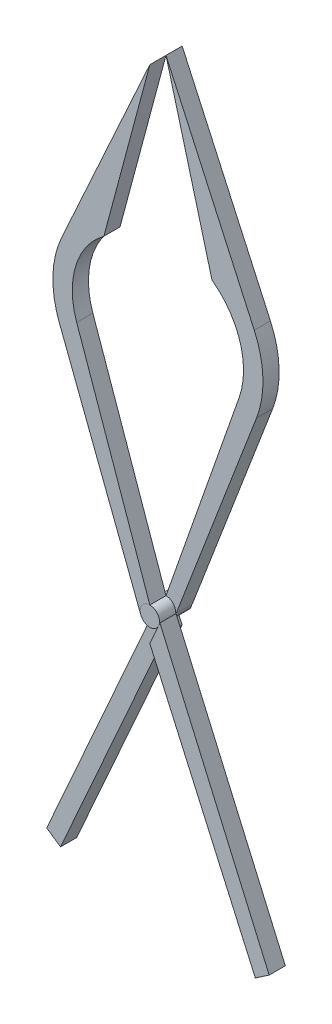
ISO-10303-21;
HEADER;
FILE_DESCRIPTION(('STEP AP214'),'2;1');
FILE_NAME('part.step','',(''),(''),'','','');
FILE_SCHEMA(('AUTOMOTIVE_DESIGN { 1 0 10303 214 1 1 1 1 }'));
ENDSEC;
DATA;
#1=APPLICATION_CONTEXT('core data for automotive mechanical design processes');
#2=APPLICATION_PROTOCOL_DEFINITION('international standard','automotive_design',2000,#1);
#3=PRODUCT_CONTEXT('',#1,'mechanical');
#4=PRODUCT('Part','Part','',(#3));
#5=PRODUCT_RELATED_PRODUCT_CATEGORY('part','',(#4));
#6=PRODUCT_DEFINITION_FORMATION('','',#4);
#7=PRODUCT_DEFINITION_CONTEXT('part definition',#1,'design');
#8=PRODUCT_DEFINITION('design','',#6,#7);
#9=PRODUCT_DEFINITION_SHAPE('','',#8);
#10=(LENGTH_UNIT() NAMED_UNIT(*) SI_UNIT(.MILLI.,.METRE.));
#11=(NAMED_UNIT(*) PLANE_ANGLE_UNIT() SI_UNIT($,.RADIAN.));
#12=(NAMED_UNIT(*) SI_UNIT($,.STERADIAN.) SOLID_ANGLE_UNIT());
#13=UNCERTAINTY_MEASURE_WITH_UNIT(LENGTH_MEASURE(1.E-05),#10,'distance_accuracy_value','');
#14=(GEOMETRIC_REPRESENTATION_CONTEXT(3) GLOBAL_UNCERTAINTY_ASSIGNED_CONTEXT((#13)) GLOBAL_UNIT_ASSIGNED_CONTEXT((#10,
#11,#12)) REPRESENTATION_CONTEXT('',''));
#15=CARTESIAN_POINT('',(0.,0.,0.));
#16=DIRECTION('',(0.,0.,1.));
#17=DIRECTION('',(1.,0.,0.));
#18=AXIS2_PLACEMENT_3D('',#15,#16,#17);
#19=CARTESIAN_POINT('',(0.,-37.6826435132161,-2.5));
#20=DIRECTION('',(0.,0.,1.));
#21=DIRECTION('',(1.,0.,0.));
#22=AXIS2_PLACEMENT_3D('',#19,#20,#21);
#23=CYLINDRICAL_SURFACE('',#22,1.49574831072217);
#24=CARTESIAN_POINT('',(0.,-37.6826435132161,0.));
#25=DIRECTION('',(0.,0.,1.));
#26=DIRECTION('',(1.,0.,0.));
#27=AXIS2_PLACEMENT_3D('',#24,#25,#26);
#28=CIRCLE('',#27,1.49574831072217);
#29=CARTESIAN_POINT('',(-1.39640134585648,-38.2186717683655,0.));
#30=VERTEX_POINT('',#29);
#31=CARTESIAN_POINT('',(-1.36640538749044,-38.2910835892017,0.));
#32=VERTEX_POINT('',#31);
#33=EDGE_CURVE('E134',#30,#32,#28,.T.);
#34=ORIENTED_EDGE('',*,*,#33,.T.);
#35=DIRECTION('',(0.,0.,1.));
#36=VECTOR('',#35,1.);
#37=CARTESIAN_POINT('',(-1.36640538749044,-38.2910835892017,-2.5));
#38=LINE('',#37,#36);
#39=CARTESIAN_POINT('',(-1.36640538749044,-38.2910835892017,-2.5));
#40=VERTEX_POINT('',#39);
#41=EDGE_CURVE('E12',#40,#32,#38,.T.);
#42=ORIENTED_EDGE('',*,*,#41,.F.);
#43=CARTESIAN_POINT('',(0.,-37.6826435132161,-2.5));
#44=DIRECTION('',(0.,0.,1.));
#45=DIRECTION('',(1.,0.,0.));
#46=AXIS2_PLACEMENT_3D('',#43,#44,#45);
#47=CIRCLE('',#46,1.49574831072217);
#48=CARTESIAN_POINT('',(-1.39640134585648,-38.2186717683655,-2.5));
#49=VERTEX_POINT('',#48);
#50=EDGE_CURVE('E76',#49,#40,#47,.T.);
#51=ORIENTED_EDGE('',*,*,#50,.F.);
#52=DIRECTION('',(0.,0.,1.));
#53=VECTOR('',#52,1.);
#54=CARTESIAN_POINT('',(-1.39640134585648,-38.2186717683655,-2.5));
#55=LINE('',#54,#53);
#56=EDGE_CURVE('E61',#49,#30,#55,.T.);
#57=ORIENTED_EDGE('',*,*,#56,.T.);
#58=EDGE_LOOP('',(#34,#42,#51,#57));
#59=FACE_BOUND('',#58,.T.);
#60=ADVANCED_FACE('F58',(#59),#23,.F.);
#61=CARTESIAN_POINT('',(-15.3694250089117,-6.8437772610449,-2.5));
#62=DIRECTION('',(0.913526278248464,0.406779717967244,0.));
#63=DIRECTION('',(-0.406779717967244,0.913526278248464,0.));
#64=AXIS2_PLACEMENT_3D('',#61,#62,#63);
#65=PLANE('',#64);
#66=DIRECTION('',(-0.406779717967244,0.913526278248464,0.));
#67=VECTOR('',#66,1.);
#68=CARTESIAN_POINT('',(-15.3694250089117,-6.8437772610449,0.));
#69=LINE('',#68,#67);
#70=CARTESIAN_POINT('',(-0.00103530845089843,-41.3573658831415,0.));
#71=VERTEX_POINT('',#70);
#72=EDGE_CURVE('E142',#71,#32,#69,.T.);
#73=ORIENTED_EDGE('',*,*,#72,.F.);
#74=DIRECTION('',(0.,0.,1.));
#75=VECTOR('',#74,1.);
#76=CARTESIAN_POINT('',(-0.00103530845089843,-41.3573658831415,-2.5));
#77=LINE('',#76,#75);
#78=CARTESIAN_POINT('',(-0.00103530845089843,-41.3573658831415,-2.5));
#79=VERTEX_POINT('',#78);
#80=EDGE_CURVE('E67',#79,#71,#77,.T.);
#81=ORIENTED_EDGE('',*,*,#80,.F.);
#82=DIRECTION('',(-0.406779717967244,0.913526278248464,0.));
#83=VECTOR('',#82,1.);
#84=CARTESIAN_POINT('',(-15.3694250089117,-6.8437772610449,-2.5));
#85=LINE('',#84,#83);
#86=EDGE_CURVE('E117',#79,#40,#85,.T.);
#87=ORIENTED_EDGE('',*,*,#86,.T.);
#88=ORIENTED_EDGE('',*,*,#41,.T.);
#89=EDGE_LOOP('',(#73,#81,#87,#88));
#90=FACE_BOUND('',#89,.T.);
#91=ADVANCED_FACE('F158',(#90),#65,.T.);
#92=CARTESIAN_POINT('',(15.3663921932048,-6.84155859411592,-2.5));
#93=DIRECTION('',(-0.913545457642601,0.4067366430758,0.));
#94=DIRECTION('',(-0.4067366430758,-0.913545457642601,0.));
#95=AXIS2_PLACEMENT_3D('',#92,#93,#94);
#96=PLANE('',#95);
#97=DIRECTION('',(-0.4067366430758,-0.913545457642601,0.));
#98=VECTOR('',#97,1.);
#99=CARTESIAN_POINT('',(15.3663921932048,-6.84155859411592,0.));
#100=LINE('',#99,#98);
#101=CARTESIAN_POINT('',(-16.3178548927108,-78.0055427025498,0.));
#102=VERTEX_POINT('',#101);
#103=EDGE_CURVE('E121',#71,#102,#100,.T.);
#104=ORIENTED_EDGE('',*,*,#103,.T.);
#105=DIRECTION('',(0.,0.,1.));
#106=VECTOR('',#105,1.);
#107=CARTESIAN_POINT('',(-16.3178548927108,-78.0055427025498,-2.5));
#108=LINE('',#107,#106);
#109=CARTESIAN_POINT('',(-16.3178548927108,-78.0055427025498,-2.5));
#110=VERTEX_POINT('',#109);
#111=EDGE_CURVE('E119',#110,#102,#108,.T.);
#112=ORIENTED_EDGE('',*,*,#111,.F.);
#113=DIRECTION('',(-0.4067366430758,-0.913545457642601,0.));
#114=VECTOR('',#113,1.);
#115=CARTESIAN_POINT('',(15.3663921932048,-6.84155859411592,-2.5));
#116=LINE('',#115,#114);
#117=EDGE_CURVE('E112',#79,#110,#116,.T.);
#118=ORIENTED_EDGE('',*,*,#117,.F.);
#119=ORIENTED_EDGE('',*,*,#80,.T.);
#120=EDGE_LOOP('',(#104,#112,#118,#119));
#121=FACE_BOUND('',#120,.T.);
#122=ADVANCED_FACE('F120',(#121),#96,.F.);
#123=CARTESIAN_POINT('',(-41.4493231296583,-60.901032136183,-2.5));
#124=DIRECTION('',(-0.562649902814867,-0.826695280537164,0.));
#125=DIRECTION('',(0.826695280537164,-0.562649902814867,0.));
#126=AXIS2_PLACEMENT_3D('',#123,#124,#125);
#127=PLANE('',#126);
#128=DIRECTION('',(0.826695280537164,-0.562649902814867,0.));
#129=VECTOR('',#128,1.);
#130=CARTESIAN_POINT('',(-41.4493231296583,-60.901032136183,0.));
#131=LINE('',#130,#129);
#132=CARTESIAN_POINT('',(-18.4611802158742,-76.546792648969,0.));
#133=VERTEX_POINT('',#132);
#134=EDGE_CURVE('E139',#133,#102,#131,.T.);
#135=ORIENTED_EDGE('',*,*,#134,.F.);
#136=DIRECTION('',(0.,0.,1.));
#137=VECTOR('',#136,1.);
#138=CARTESIAN_POINT('',(-18.4611802158742,-76.546792648969,-2.5));
#139=LINE('',#138,#137);
#140=CARTESIAN_POINT('',(-18.4611802158742,-76.546792648969,-2.5));
#141=VERTEX_POINT('',#140);
#142=EDGE_CURVE('E125',#141,#133,#139,.T.);
#143=ORIENTED_EDGE('',*,*,#142,.F.);
#144=DIRECTION('',(0.826695280537164,-0.562649902814867,0.));
#145=VECTOR('',#144,1.);
#146=CARTESIAN_POINT('',(-41.4493231296583,-60.901032136183,-2.5));
#147=LINE('',#146,#145);
#148=EDGE_CURVE('E116',#141,#110,#147,.T.);
#149=ORIENTED_EDGE('',*,*,#148,.T.);
#150=ORIENTED_EDGE('',*,*,#111,.T.);
#151=EDGE_LOOP('',(#135,#143,#149,#150));
#152=FACE_BOUND('',#151,.T.);
#153=ADVANCED_FACE('F127',(#152),#127,.T.);
#154=CARTESIAN_POINT('',(13.035615968075,-5.80383015965301,-2.5));
#155=DIRECTION('',(-0.913545457642601,0.4067366430758,0.));
#156=DIRECTION('',(-0.4067366430758,-0.913545457642601,0.));
#157=AXIS2_PLACEMENT_3D('',#154,#155,#156);
#158=PLANE('',#157);
#159=DIRECTION('',(-0.4067366430758,-0.913545457642601,0.));
#160=VECTOR('',#159,1.);
#161=CARTESIAN_POINT('',(13.035615968075,-5.80383015965301,0.));
#162=LINE('',#161,#160);
#163=EDGE_CURVE('E136',#30,#133,#162,.T.);
#164=ORIENTED_EDGE('',*,*,#163,.F.);
#165=ORIENTED_EDGE('',*,*,#56,.F.);
#166=DIRECTION('',(-0.4067366430758,-0.913545457642601,0.));
#167=VECTOR('',#166,1.);
#168=CARTESIAN_POINT('',(13.035615968075,-5.80383015965301,-2.5));
#169=LINE('',#168,#167);
#170=EDGE_CURVE('E128',#49,#141,#169,.T.);
#171=ORIENTED_EDGE('',*,*,#170,.T.);
#172=ORIENTED_EDGE('',*,*,#142,.T.);
#173=EDGE_LOOP('',(#164,#165,#171,#172));
#174=FACE_BOUND('',#173,.T.);
#175=ADVANCED_FACE('F149',(#174),#158,.T.);
#176=CARTESIAN_POINT('',(0.,0.,-2.5));
#177=DIRECTION('',(0.,0.,1.));
#178=DIRECTION('',(1.,0.,0.));
#179=AXIS2_PLACEMENT_3D('',#176,#177,#178);
#180=PLANE('',#179);
#181=ORIENTED_EDGE('',*,*,#50,.T.);
#182=ORIENTED_EDGE('',*,*,#86,.F.);
#183=ORIENTED_EDGE('',*,*,#117,.T.);
#184=ORIENTED_EDGE('',*,*,#148,.F.);
#185=ORIENTED_EDGE('',*,*,#170,.F.);
#186=EDGE_LOOP('',(#181,#182,#183,#184,#185));
#187=FACE_BOUND('',#186,.T.);
#188=ADVANCED_FACE('F114',(#187),#180,.F.);
#189=CARTESIAN_POINT('',(0.,0.,0.));
#190=DIRECTION('',(0.,0.,1.));
#191=DIRECTION('',(1.,0.,0.));
#192=AXIS2_PLACEMENT_3D('',#189,#190,#191);
#193=PLANE('',#192);
#194=ORIENTED_EDGE('',*,*,#33,.F.);
#195=ORIENTED_EDGE('',*,*,#163,.T.);
#196=ORIENTED_EDGE('',*,*,#134,.T.);
#197=ORIENTED_EDGE('',*,*,#103,.F.);
#198=ORIENTED_EDGE('',*,*,#72,.T.);
#199=EDGE_LOOP('',(#194,#195,#196,#197,#198));
#200=FACE_BOUND('',#199,.T.);
#201=ADVANCED_FACE('F148',(#200),#193,.T.);
#202=CLOSED_SHELL('',(#60,#91,#122,#153,#175,#188,#201));
#203=MANIFOLD_SOLID_BREP('B2',#202);
#204=CARTESIAN_POINT('',(0.,-37.6826435132161,2.5));
#205=DIRECTION('',(0.,0.,-1.));
#206=DIRECTION('',(-1.,0.,0.));
#207=AXIS2_PLACEMENT_3D('',#204,#205,#206);
#208=CYLINDRICAL_SURFACE('',#207,1.49574831072217);
#209=CARTESIAN_POINT('',(0.,-37.6826435132161,0.));
#210=DIRECTION('',(0.,0.,1.));
#211=DIRECTION('',(1.,0.,0.));
#212=AXIS2_PLACEMENT_3D('',#209,#210,#211);
#213=CIRCLE('',#212,1.49574831072217);
#214=CARTESIAN_POINT('',(1.33272150339722,-38.3616990362854,0.));
#215=VERTEX_POINT('',#214);
#216=CARTESIAN_POINT('',(1.39640134585648,-38.2186717683655,0.));
#217=VERTEX_POINT('',#216);
#218=EDGE_CURVE('E300',#215,#217,#213,.T.);
#219=ORIENTED_EDGE('',*,*,#218,.F.);
#220=DIRECTION('',(0.,0.,-1.));
#221=VECTOR('',#220,1.);
#222=CARTESIAN_POINT('',(1.33272150339722,-38.3616990362854,2.5));
#223=LINE('',#222,#221);
#224=CARTESIAN_POINT('',(1.33272150339722,-38.3616990362854,2.5));
#225=VERTEX_POINT('',#224);
#226=EDGE_CURVE('E56',#225,#215,#223,.T.);
#227=ORIENTED_EDGE('',*,*,#226,.F.);
#228=CARTESIAN_POINT('',(0.,-37.6826435132161,2.5));
#229=DIRECTION('',(0.,0.,1.));
#230=DIRECTION('',(1.,0.,0.));
#231=AXIS2_PLACEMENT_3D('',#228,#229,#230);
#232=CIRCLE('',#231,1.49574831072217);
#233=CARTESIAN_POINT('',(1.39640134585648,-38.2186717683655,2.5));
#234=VERTEX_POINT('',#233);
#235=EDGE_CURVE('E313',#225,#234,#232,.T.);
#236=ORIENTED_EDGE('',*,*,#235,.T.);
#237=DIRECTION('',(0.,0.,-1.));
#238=VECTOR('',#237,1.);
#239=CARTESIAN_POINT('',(1.39640134585648,-38.2186717683655,2.5));
#240=LINE('',#239,#238);
#241=EDGE_CURVE('E262',#234,#217,#240,.T.);
#242=ORIENTED_EDGE('',*,*,#241,.T.);
#243=EDGE_LOOP('',(#219,#227,#236,#242));
#244=FACE_BOUND('',#243,.T.);
#245=ADVANCED_FACE('F218',(#244),#208,.F.);
#246=CARTESIAN_POINT('',(15.3663921932048,-6.84155859411592,2.5));
#247=DIRECTION('',(0.913545457642601,-0.4067366430758,0.));
#248=DIRECTION('',(0.4067366430758,0.913545457642601,0.));
#249=AXIS2_PLACEMENT_3D('',#246,#247,#248);
#250=PLANE('',#249);
#251=DIRECTION('',(-0.4067366430758,-0.913545457642601,0.));
#252=VECTOR('',#251,1.);
#253=CARTESIAN_POINT('',(15.3663921932048,-6.84155859411592,0.));
#254=LINE('',#253,#252);
#255=CARTESIAN_POINT('',(-0.00103530845089843,-41.3573658831415,0.));
#256=VERTEX_POINT('',#255);
#257=EDGE_CURVE('E303',#215,#256,#254,.T.);
#258=ORIENTED_EDGE('',*,*,#257,.T.);
#259=DIRECTION('',(0.,0.,-1.));
#260=VECTOR('',#259,1.);
#261=CARTESIAN_POINT('',(-0.00103530845089843,-41.3573658831415,2.5));
#262=LINE('',#261,#260);
#263=CARTESIAN_POINT('',(-0.00103530845089843,-41.3573658831415,2.5));
#264=VERTEX_POINT('',#263);
#265=EDGE_CURVE('E226',#264,#256,#262,.T.);
#266=ORIENTED_EDGE('',*,*,#265,.F.);
#267=DIRECTION('',(-0.4067366430758,-0.913545457642601,0.));
#268=VECTOR('',#267,1.);
#269=CARTESIAN_POINT('',(15.3663921932048,-6.84155859411592,2.5));
#270=LINE('',#269,#268);
#271=EDGE_CURVE('E295',#225,#264,#270,.T.);
#272=ORIENTED_EDGE('',*,*,#271,.F.);
#273=ORIENTED_EDGE('',*,*,#226,.T.);
#274=EDGE_LOOP('',(#258,#266,#272,#273));
#275=FACE_BOUND('',#274,.T.);
#276=ADVANCED_FACE('F322',(#275),#250,.F.);
#277=CARTESIAN_POINT('',(-15.3694250089117,-6.8437772610449,2.5));
#278=DIRECTION('',(-0.913526278248464,-0.406779717967244,0.));
#279=DIRECTION('',(0.406779717967244,-0.913526278248464,0.));
#280=AXIS2_PLACEMENT_3D('',#277,#278,#279);
#281=PLANE('',#280);
#282=DIRECTION('',(-0.406779717967244,0.913526278248464,0.));
#283=VECTOR('',#282,1.);
#284=CARTESIAN_POINT('',(-15.3694250089117,-6.8437772610449,0.));
#285=LINE('',#284,#283);
#286=CARTESIAN_POINT('',(16.3178548927108,-78.0055427025498,0.));
#287=VERTEX_POINT('',#286);
#288=EDGE_CURVE('E306',#287,#256,#285,.T.);
#289=ORIENTED_EDGE('',*,*,#288,.F.);
#290=DIRECTION('',(0.,0.,-1.));
#291=VECTOR('',#290,1.);
#292=CARTESIAN_POINT('',(16.3178548927108,-78.0055427025498,2.5));
#293=LINE('',#292,#291);
#294=CARTESIAN_POINT('',(16.3178548927108,-78.0055427025498,2.5));
#295=VERTEX_POINT('',#294);
#296=EDGE_CURVE('E284',#295,#287,#293,.T.);
#297=ORIENTED_EDGE('',*,*,#296,.F.);
#298=DIRECTION('',(-0.406779717967244,0.913526278248464,0.));
#299=VECTOR('',#298,1.);
#300=CARTESIAN_POINT('',(-15.3694250089117,-6.8437772610449,2.5));
#301=LINE('',#300,#299);
#302=EDGE_CURVE('E293',#295,#264,#301,.T.);
#303=ORIENTED_EDGE('',*,*,#302,.T.);
#304=ORIENTED_EDGE('',*,*,#265,.T.);
#305=EDGE_LOOP('',(#289,#297,#303,#304));
#306=FACE_BOUND('',#305,.T.);
#307=ADVANCED_FACE('F319',(#306),#281,.T.);
#308=CARTESIAN_POINT('',(41.4493231296582,-60.9010321361833,2.5));
#309=DIRECTION('',(0.562649902814864,-0.826695280537166,0.));
#310=DIRECTION('',(0.826695280537166,0.562649902814864,0.));
#311=AXIS2_PLACEMENT_3D('',#308,#309,#310);
#312=PLANE('',#311);
#313=DIRECTION('',(-0.826695280537166,-0.562649902814864,0.));
#314=VECTOR('',#313,1.);
#315=CARTESIAN_POINT('',(41.4493231296582,-60.9010321361833,0.));
#316=LINE('',#315,#314);
#317=CARTESIAN_POINT('',(18.4611802158743,-76.546792648969,0.));
#318=VERTEX_POINT('',#317);
#319=EDGE_CURVE('E283',#318,#287,#316,.T.);
#320=ORIENTED_EDGE('',*,*,#319,.F.);
#321=DIRECTION('',(0.,0.,-1.));
#322=VECTOR('',#321,1.);
#323=CARTESIAN_POINT('',(18.4611802158743,-76.546792648969,2.5));
#324=LINE('',#323,#322);
#325=CARTESIAN_POINT('',(18.4611802158743,-76.546792648969,2.5));
#326=VERTEX_POINT('',#325);
#327=EDGE_CURVE('E277',#326,#318,#324,.T.);
#328=ORIENTED_EDGE('',*,*,#327,.F.);
#329=DIRECTION('',(-0.826695280537166,-0.562649902814864,0.));
#330=VECTOR('',#329,1.);
#331=CARTESIAN_POINT('',(41.4493231296582,-60.9010321361833,2.5));
#332=LINE('',#331,#330);
#333=EDGE_CURVE('E281',#326,#295,#332,.T.);
#334=ORIENTED_EDGE('',*,*,#333,.T.);
#335=ORIENTED_EDGE('',*,*,#296,.T.);
#336=EDGE_LOOP('',(#320,#328,#334,#335));
#337=FACE_BOUND('',#336,.T.);
#338=ADVANCED_FACE('F279',(#337),#312,.T.);
#339=CARTESIAN_POINT('',(-12.5604087554763,-5.48301620337997,2.5));
#340=DIRECTION('',(-0.916482918444254,-0.400073818438425,0.));
#341=DIRECTION('',(0.400073818438425,-0.916482918444254,0.));
#342=AXIS2_PLACEMENT_3D('',#339,#340,#341);
#343=PLANE('',#342);
#344=DIRECTION('',(-0.400073818438425,0.916482918444254,0.));
#345=VECTOR('',#344,1.);
#346=CARTESIAN_POINT('',(-12.5604087554763,-5.48301620337997,0.));
#347=LINE('',#346,#345);
#348=CARTESIAN_POINT('',(1.55237161959559,-37.8123553138304,0.));
#349=VERTEX_POINT('',#348);
#350=EDGE_CURVE('E255',#318,#349,#347,.T.);
#351=ORIENTED_EDGE('',*,*,#350,.T.);
#352=DIRECTION('',(0.,0.,-1.));
#353=VECTOR('',#352,1.);
#354=CARTESIAN_POINT('',(1.55237161959559,-37.8123553138304,2.5));
#355=LINE('',#354,#353);
#356=CARTESIAN_POINT('',(1.55237161959559,-37.8123553138304,2.5));
#357=VERTEX_POINT('',#356);
#358=EDGE_CURVE('E285',#357,#349,#355,.T.);
#359=ORIENTED_EDGE('',*,*,#358,.F.);
#360=DIRECTION('',(-0.400073818438425,0.916482918444254,0.));
#361=VECTOR('',#360,1.);
#362=CARTESIAN_POINT('',(-12.5604087554763,-5.48301620337997,2.5));
#363=LINE('',#362,#361);
#364=EDGE_CURVE('E287',#326,#357,#363,.T.);
#365=ORIENTED_EDGE('',*,*,#364,.F.);
#366=ORIENTED_EDGE('',*,*,#327,.T.);
#367=EDGE_LOOP('',(#351,#359,#365,#366));
#368=FACE_BOUND('',#367,.T.);
#369=ADVANCED_FACE('F288',(#368),#343,.F.);
#370=CARTESIAN_POINT('',(14.003706397458,-5.37551924317953,2.5));
#371=DIRECTION('',(0.933580426497201,-0.358367949545302,0.));
#372=DIRECTION('',(0.358367949545302,0.933580426497201,0.));
#373=AXIS2_PLACEMENT_3D('',#370,#371,#372);
#374=PLANE('',#373);
#375=DIRECTION('',(-0.358367949545302,-0.933580426497201,0.));
#376=VECTOR('',#375,1.);
#377=CARTESIAN_POINT('',(14.003706397458,-5.37551924317953,0.));
#378=LINE('',#377,#376);
#379=EDGE_CURVE('E311',#349,#217,#378,.T.);
#380=ORIENTED_EDGE('',*,*,#379,.T.);
#381=ORIENTED_EDGE('',*,*,#241,.F.);
#382=DIRECTION('',(-0.358367949545302,-0.933580426497201,0.));
#383=VECTOR('',#382,1.);
#384=CARTESIAN_POINT('',(14.003706397458,-5.37551924317953,2.5));
#385=LINE('',#384,#383);
#386=EDGE_CURVE('E234',#357,#234,#385,.T.);
#387=ORIENTED_EDGE('',*,*,#386,.F.);
#388=ORIENTED_EDGE('',*,*,#358,.T.);
#389=EDGE_LOOP('',(#380,#381,#387,#388));
#390=FACE_BOUND('',#389,.T.);
#391=ADVANCED_FACE('F327',(#390),#374,.F.);
#392=CARTESIAN_POINT('',(0.,0.,2.5));
#393=DIRECTION('',(0.,0.,1.));
#394=DIRECTION('',(1.,0.,0.));
#395=AXIS2_PLACEMENT_3D('',#392,#393,#394);
#396=PLANE('',#395);
#397=ORIENTED_EDGE('',*,*,#235,.F.);
#398=ORIENTED_EDGE('',*,*,#271,.T.);
#399=ORIENTED_EDGE('',*,*,#302,.F.);
#400=ORIENTED_EDGE('',*,*,#333,.F.);
#401=ORIENTED_EDGE('',*,*,#364,.T.);
#402=ORIENTED_EDGE('',*,*,#386,.T.);
#403=EDGE_LOOP('',(#397,#398,#399,#400,#401,#402));
#404=FACE_BOUND('',#403,.T.);
#405=ADVANCED_FACE('F291',(#404),#396,.T.);
#406=CARTESIAN_POINT('',(0.,0.,0.));
#407=DIRECTION('',(0.,0.,1.));
#408=DIRECTION('',(1.,0.,0.));
#409=AXIS2_PLACEMENT_3D('',#406,#407,#408);
#410=PLANE('',#409);
#411=ORIENTED_EDGE('',*,*,#218,.T.);
#412=ORIENTED_EDGE('',*,*,#379,.F.);
#413=ORIENTED_EDGE('',*,*,#350,.F.);
#414=ORIENTED_EDGE('',*,*,#319,.T.);
#415=ORIENTED_EDGE('',*,*,#288,.T.);
#416=ORIENTED_EDGE('',*,*,#257,.F.);
#417=EDGE_LOOP('',(#411,#412,#413,#414,#415,#416));
#418=FACE_BOUND('',#417,.T.);
#419=ADVANCED_FACE('F324',(#418),#410,.F.);
#420=CLOSED_SHELL('',(#245,#276,#307,#338,#369,#391,#405,#419));
#421=MANIFOLD_SOLID_BREP('B6',#420);
#422=CARTESIAN_POINT('',(0.,-37.6826435132161,2.5));
#423=DIRECTION('',(0.,0.,-1.));
#424=DIRECTION('',(-1.,0.,0.));
#425=AXIS2_PLACEMENT_3D('',#422,#423,#424);
#426=CYLINDRICAL_SURFACE('',#425,1.49574831072217);
#427=CARTESIAN_POINT('',(0.,-37.6826435132161,0.));
#428=DIRECTION('',(0.,0.,1.));
#429=DIRECTION('',(1.,0.,0.));
#430=AXIS2_PLACEMENT_3D('',#427,#428,#429);
#431=CIRCLE('',#430,1.49574831072217);
#432=CARTESIAN_POINT('',(0.,-36.186895202494,0.));
#433=VERTEX_POINT('',#432);
#434=CARTESIAN_POINT('',(-1.39640134585648,-38.2186717683655,0.));
#435=VERTEX_POINT('',#434);
#436=EDGE_CURVE('E489',#433,#435,#431,.T.);
#437=ORIENTED_EDGE('',*,*,#436,.F.);
#438=DIRECTION('',(0.,0.,-1.));
#439=VECTOR('',#438,1.);
#440=CARTESIAN_POINT('',(0.,-36.186895202494,2.5));
#441=LINE('',#440,#439);
#442=CARTESIAN_POINT('',(0.,-36.186895202494,2.5));
#443=VERTEX_POINT('',#442);
#444=EDGE_CURVE('E216',#443,#433,#441,.T.);
#445=ORIENTED_EDGE('',*,*,#444,.F.);
#446=CARTESIAN_POINT('',(0.,-37.6826435132161,2.5));
#447=DIRECTION('',(0.,0.,1.));
#448=DIRECTION('',(1.,0.,0.));
#449=AXIS2_PLACEMENT_3D('',#446,#447,#448);
#450=CIRCLE('',#449,1.49574831072217);
#451=CARTESIAN_POINT('',(-1.39640134585648,-38.2186717683655,2.5));
#452=VERTEX_POINT('',#451);
#453=EDGE_CURVE('E505',#443,#452,#450,.T.);
#454=ORIENTED_EDGE('',*,*,#453,.T.);
#455=DIRECTION('',(0.,0.,-1.));
#456=VECTOR('',#455,1.);
#457=CARTESIAN_POINT('',(-1.39640134585648,-38.2186717683655,2.5));
#458=LINE('',#457,#456);
#459=EDGE_CURVE('E451',#452,#435,#458,.T.);
#460=ORIENTED_EDGE('',*,*,#459,.T.);
#461=EDGE_LOOP('',(#437,#445,#454,#460));
#462=FACE_BOUND('',#461,.T.);
#463=ADVANCED_FACE('F403',(#462),#426,.F.);
#464=CARTESIAN_POINT('',(-11.3209913112431,-3.97934111766725,2.5));
#465=DIRECTION('',(0.943415942603595,0.331611759805604,0.));
#466=DIRECTION('',(-0.331611759805604,0.943415942603595,0.));
#467=AXIS2_PLACEMENT_3D('',#464,#465,#466);
#468=PLANE('',#467);
#469=DIRECTION('',(0.331611759805604,-0.943415942603595,0.));
#470=VECTOR('',#469,1.);
#471=CARTESIAN_POINT('',(-11.3209913112431,-3.97934111766725,0.));
#472=LINE('',#471,#470);
#473=CARTESIAN_POINT('',(-11.3209913112431,-3.97934111766725,0.));
#474=VERTEX_POINT('',#473);
#475=EDGE_CURVE('E492',#474,#433,#472,.T.);
#476=ORIENTED_EDGE('',*,*,#475,.F.);
#477=DIRECTION('',(0.,0.,-1.));
#478=VECTOR('',#477,1.);
#479=CARTESIAN_POINT('',(-11.3209913112431,-3.97934111766725,2.5));
#480=LINE('',#479,#478);
#481=CARTESIAN_POINT('',(-11.3209913112431,-3.97934111766725,2.5));
#482=VERTEX_POINT('',#481);
#483=EDGE_CURVE('E411',#482,#474,#480,.T.);
#484=ORIENTED_EDGE('',*,*,#483,.F.);
#485=DIRECTION('',(0.331611759805604,-0.943415942603595,0.));
#486=VECTOR('',#485,1.);
#487=CARTESIAN_POINT('',(-11.3209913112431,-3.97934111766725,2.5));
#488=LINE('',#487,#486);
#489=EDGE_CURVE('E525',#482,#443,#488,.T.);
#490=ORIENTED_EDGE('',*,*,#489,.T.);
#491=ORIENTED_EDGE('',*,*,#444,.T.);
#492=EDGE_LOOP('',(#476,#484,#490,#491));
#493=FACE_BOUND('',#492,.T.);
#494=ADVANCED_FACE('F519',(#493),#468,.T.);
#495=CARTESIAN_POINT('',(0.,0.,2.5));
#496=DIRECTION('',(0.,0.,-1.));
#497=DIRECTION('',(-1.,0.,0.));
#498=AXIS2_PLACEMENT_3D('',#495,#496,#497);
#499=CYLINDRICAL_SURFACE('',#498,12.);
#500=CARTESIAN_POINT('',(0.,0.,0.));
#501=DIRECTION('',(0.,0.,1.));
#502=DIRECTION('',(1.,0.,0.));
#503=AXIS2_PLACEMENT_3D('',#500,#501,#502);
#504=CIRCLE('',#503,12.);
#505=CARTESIAN_POINT('',(-7.11383039620248,9.66402696054113,0.));
#506=VERTEX_POINT('',#505);
#507=EDGE_CURVE('E495',#506,#474,#504,.T.);
#508=ORIENTED_EDGE('',*,*,#507,.F.);
#509=DIRECTION('',(0.,0.,-1.));
#510=VECTOR('',#509,1.);
#511=CARTESIAN_POINT('',(-7.11383039620248,9.66402696054113,2.5));
#512=LINE('',#511,#510);
#513=CARTESIAN_POINT('',(-7.11383039620248,9.66402696054113,2.5));
#514=VERTEX_POINT('',#513);
#515=EDGE_CURVE('E509',#514,#506,#512,.T.);
#516=ORIENTED_EDGE('',*,*,#515,.F.);
#517=CARTESIAN_POINT('',(0.,0.,2.5));
#518=DIRECTION('',(0.,0.,1.));
#519=DIRECTION('',(1.,0.,0.));
#520=AXIS2_PLACEMENT_3D('',#517,#518,#519);
#521=CIRCLE('',#520,12.);
#522=EDGE_CURVE('E515',#514,#482,#521,.T.);
#523=ORIENTED_EDGE('',*,*,#522,.T.);
#524=ORIENTED_EDGE('',*,*,#483,.T.);
#525=EDGE_LOOP('',(#508,#516,#523,#524));
#526=FACE_BOUND('',#525,.T.);
#527=ADVANCED_FACE('F514',(#526),#499,.F.);
#528=CARTESIAN_POINT('',(-9.05330085889916,2.42582465397804,2.5));
#529=DIRECTION('',(0.965925826289068,-0.258819045102522,0.));
#530=DIRECTION('',(0.258819045102522,0.965925826289068,0.));
#531=AXIS2_PLACEMENT_3D('',#528,#529,#530);
#532=PLANE('',#531);
#533=DIRECTION('',(-0.258819045102522,-0.965925826289068,0.));
#534=VECTOR('',#533,1.);
#535=CARTESIAN_POINT('',(-9.05330085889916,2.42582465397804,0.));
#536=LINE('',#535,#534);
#537=CARTESIAN_POINT('',(0.,36.2132034355964,0.));
#538=VERTEX_POINT('',#537);
#539=EDGE_CURVE('E498',#538,#506,#536,.T.);
#540=ORIENTED_EDGE('',*,*,#539,.F.);
#541=DIRECTION('',(0.,0.,-1.));
#542=VECTOR('',#541,1.);
#543=CARTESIAN_POINT('',(0.,36.2132034355964,2.5));
#544=LINE('',#543,#542);
#545=CARTESIAN_POINT('',(0.,36.2132034355964,2.5));
#546=VERTEX_POINT('',#545);
#547=EDGE_CURVE('E481',#546,#538,#544,.T.);
#548=ORIENTED_EDGE('',*,*,#547,.F.);
#549=DIRECTION('',(-0.258819045102522,-0.965925826289068,0.));
#550=VECTOR('',#549,1.);
#551=CARTESIAN_POINT('',(-9.05330085889916,2.42582465397804,2.5));
#552=LINE('',#551,#550);
#553=EDGE_CURVE('E474',#546,#514,#552,.T.);
#554=ORIENTED_EDGE('',*,*,#553,.T.);
#555=ORIENTED_EDGE('',*,*,#515,.T.);
#556=EDGE_LOOP('',(#540,#548,#554,#555));
#557=FACE_BOUND('',#556,.T.);
#558=ADVANCED_FACE('F524',(#557),#532,.T.);
#559=CARTESIAN_POINT('',(-13.6526958168668,6.21320343559643,2.5));
#560=DIRECTION('',(0.910179721124455,-0.414213562373095,0.));
#561=DIRECTION('',(0.414213562373095,0.910179721124455,0.));
#562=AXIS2_PLACEMENT_3D('',#559,#560,#561);
#563=PLANE('',#562);
#564=DIRECTION('',(-0.414213562373095,-0.910179721124455,0.));
#565=VECTOR('',#564,1.);
#566=CARTESIAN_POINT('',(-13.6526958168668,6.21320343559643,0.));
#567=LINE('',#566,#565);
#568=CARTESIAN_POINT('',(-13.6526958168668,6.21320343559643,0.));
#569=VERTEX_POINT('',#568);
#570=EDGE_CURVE('E480',#538,#569,#567,.T.);
#571=ORIENTED_EDGE('',*,*,#570,.T.);
#572=DIRECTION('',(0.,0.,-1.));
#573=VECTOR('',#572,1.);
#574=CARTESIAN_POINT('',(-13.6526958168668,6.21320343559643,2.5));
#575=LINE('',#574,#573);
#576=CARTESIAN_POINT('',(-13.6526958168668,6.21320343559643,2.5));
#577=VERTEX_POINT('',#576);
#578=EDGE_CURVE('E477',#577,#569,#575,.T.);
#579=ORIENTED_EDGE('',*,*,#578,.F.);
#580=DIRECTION('',(-0.414213562373095,-0.910179721124455,0.));
#581=VECTOR('',#580,1.);
#582=CARTESIAN_POINT('',(-13.6526958168668,6.21320343559643,2.5));
#583=LINE('',#582,#581);
#584=EDGE_CURVE('E467',#546,#577,#583,.T.);
#585=ORIENTED_EDGE('',*,*,#584,.F.);
#586=ORIENTED_EDGE('',*,*,#547,.T.);
#587=EDGE_LOOP('',(#571,#579,#585,#586));
#588=FACE_BOUND('',#587,.T.);
#589=ADVANCED_FACE('F478',(#588),#563,.F.);
#590=CARTESIAN_POINT('',(0.,0.,2.5));
#591=DIRECTION('',(0.,0.,-1.));
#592=DIRECTION('',(-1.,0.,0.));
#593=AXIS2_PLACEMENT_3D('',#590,#591,#592);
#594=CYLINDRICAL_SURFACE('',#593,15.);
#595=CARTESIAN_POINT('',(0.,0.,0.));
#596=DIRECTION('',(0.,0.,1.));
#597=DIRECTION('',(1.,0.,0.));
#598=AXIS2_PLACEMENT_3D('',#595,#596,#597);
#599=CIRCLE('',#598,15.);
#600=CARTESIAN_POINT('',(-14.003706397458,-5.37551924317953,0.));
#601=VERTEX_POINT('',#600);
#602=EDGE_CURVE('E444',#569,#601,#599,.T.);
#603=ORIENTED_EDGE('',*,*,#602,.T.);
#604=DIRECTION('',(0.,0.,-1.));
#605=VECTOR('',#604,1.);
#606=CARTESIAN_POINT('',(-14.003706397458,-5.37551924317953,2.5));
#607=LINE('',#606,#605);
#608=CARTESIAN_POINT('',(-14.003706397458,-5.37551924317953,2.5));
#609=VERTEX_POINT('',#608);
#610=EDGE_CURVE('E482',#609,#601,#607,.T.);
#611=ORIENTED_EDGE('',*,*,#610,.F.);
#612=CARTESIAN_POINT('',(0.,0.,2.5));
#613=DIRECTION('',(0.,0.,1.));
#614=DIRECTION('',(1.,0.,0.));
#615=AXIS2_PLACEMENT_3D('',#612,#613,#614);
#616=CIRCLE('',#615,15.);
#617=EDGE_CURVE('E471',#577,#609,#616,.T.);
#618=ORIENTED_EDGE('',*,*,#617,.F.);
#619=ORIENTED_EDGE('',*,*,#578,.T.);
#620=EDGE_LOOP('',(#603,#611,#618,#619));
#621=FACE_BOUND('',#620,.T.);
#622=ADVANCED_FACE('F484',(#621),#594,.T.);
#623=CARTESIAN_POINT('',(-14.003706397458,-5.37551924317953,2.5));
#624=DIRECTION('',(0.933580426497201,0.358367949545302,0.));
#625=DIRECTION('',(-0.358367949545302,0.933580426497201,0.));
#626=AXIS2_PLACEMENT_3D('',#623,#624,#625);
#627=PLANE('',#626);
#628=DIRECTION('',(0.358367949545302,-0.933580426497201,0.));
#629=VECTOR('',#628,1.);
#630=CARTESIAN_POINT('',(-14.003706397458,-5.37551924317953,0.));
#631=LINE('',#630,#629);
#632=EDGE_CURVE('E503',#601,#435,#631,.T.);
#633=ORIENTED_EDGE('',*,*,#632,.T.);
#634=ORIENTED_EDGE('',*,*,#459,.F.);
#635=DIRECTION('',(0.358367949545302,-0.933580426497201,0.));
#636=VECTOR('',#635,1.);
#637=CARTESIAN_POINT('',(-14.003706397458,-5.37551924317953,2.5));
#638=LINE('',#637,#636);
#639=EDGE_CURVE('E419',#609,#452,#638,.T.);
#640=ORIENTED_EDGE('',*,*,#639,.F.);
#641=ORIENTED_EDGE('',*,*,#610,.T.);
#642=EDGE_LOOP('',(#633,#634,#640,#641));
#643=FACE_BOUND('',#642,.T.);
#644=ADVANCED_FACE('F544',(#643),#627,.F.);
#645=CARTESIAN_POINT('',(0.,0.,2.5));
#646=DIRECTION('',(0.,0.,1.));
#647=DIRECTION('',(1.,0.,0.));
#648=AXIS2_PLACEMENT_3D('',#645,#646,#647);
#649=PLANE('',#648);
#650=ORIENTED_EDGE('',*,*,#453,.F.);
#651=ORIENTED_EDGE('',*,*,#489,.F.);
#652=ORIENTED_EDGE('',*,*,#522,.F.);
#653=ORIENTED_EDGE('',*,*,#553,.F.);
#654=ORIENTED_EDGE('',*,*,#584,.T.);
#655=ORIENTED_EDGE('',*,*,#617,.T.);
#656=ORIENTED_EDGE('',*,*,#639,.T.);
#657=EDGE_LOOP('',(#650,#651,#652,#653,#654,#655,#656));
#658=FACE_BOUND('',#657,.T.);
#659=ADVANCED_FACE('F469',(#658),#649,.T.);
#660=CARTESIAN_POINT('',(0.,0.,0.));
#661=DIRECTION('',(0.,0.,1.));
#662=DIRECTION('',(1.,0.,0.));
#663=AXIS2_PLACEMENT_3D('',#660,#661,#662);
#664=PLANE('',#663);
#665=ORIENTED_EDGE('',*,*,#436,.T.);
#666=ORIENTED_EDGE('',*,*,#632,.F.);
#667=ORIENTED_EDGE('',*,*,#602,.F.);
#668=ORIENTED_EDGE('',*,*,#570,.F.);
#669=ORIENTED_EDGE('',*,*,#539,.T.);
#670=ORIENTED_EDGE('',*,*,#507,.T.);
#671=ORIENTED_EDGE('',*,*,#475,.T.);
#672=EDGE_LOOP('',(#665,#666,#667,#668,#669,#670,#671));
#673=FACE_BOUND('',#672,.T.);
#674=ADVANCED_FACE('F521',(#673),#664,.F.);
#675=CLOSED_SHELL('',(#463,#494,#527,#558,#589,#622,#644,#659,#674));
#676=MANIFOLD_SOLID_BREP('B50',#675);
#677=CARTESIAN_POINT('',(0.,-37.6826435132161,2.5));
#678=DIRECTION('',(0.,0.,-1.));
#679=DIRECTION('',(-1.,0.,0.));
#680=AXIS2_PLACEMENT_3D('',#677,#678,#679);
#681=CYLINDRICAL_SURFACE('',#680,1.49574831072217);
#682=CARTESIAN_POINT('',(0.,-37.6826435132161,0.));
#683=DIRECTION('',(0.,0.,1.));
#684=DIRECTION('',(1.,0.,0.));
#685=AXIS2_PLACEMENT_3D('',#682,#683,#684);
#686=CIRCLE('',#685,1.49574831072217);
#687=CARTESIAN_POINT('',(1.49574831072217,-37.6826435132161,0.));
#688=VERTEX_POINT('',#687);
#689=CARTESIAN_POINT('',(0.,-36.186895202494,0.));
#690=VERTEX_POINT('',#689);
#691=EDGE_CURVE('E620',#688,#690,#686,.T.);
#692=ORIENTED_EDGE('',*,*,#691,.T.);
#693=DIRECTION('',(0.,0.,1.));
#694=VECTOR('',#693,1.);
#695=CARTESIAN_POINT('',(0.,-36.186895202494,-2.5));
#696=LINE('',#695,#694);
#697=CARTESIAN_POINT('',(0.,-36.186895202494,-2.5));
#698=VERTEX_POINT('',#697);
#699=EDGE_CURVE('E751',#698,#690,#696,.T.);
#700=ORIENTED_EDGE('',*,*,#699,.F.);
#701=CARTESIAN_POINT('',(0.,-37.6826435132161,-2.5));
#702=DIRECTION('',(0.,0.,1.));
#703=DIRECTION('',(1.,0.,0.));
#704=AXIS2_PLACEMENT_3D('',#701,#702,#703);
#705=CIRCLE('',#704,1.49574831072217);
#706=CARTESIAN_POINT('',(1.33272150339722,-38.3616990362854,-2.5));
#707=VERTEX_POINT('',#706);
#708=EDGE_CURVE('E754',#698,#707,#705,.T.);
#709=ORIENTED_EDGE('',*,*,#708,.T.);
#710=DIRECTION('',(0.,0.,-1.));
#711=VECTOR('',#710,1.);
#712=CARTESIAN_POINT('',(1.33272150339722,-38.3616990362854,2.5));
#713=LINE('',#712,#711);
#714=CARTESIAN_POINT('',(1.33272150339722,-38.3616990362854,2.5));
#715=VERTEX_POINT('',#714);
#716=EDGE_CURVE('E401',#715,#707,#713,.T.);
#717=ORIENTED_EDGE('',*,*,#716,.F.);
#718=CARTESIAN_POINT('',(0.,-37.6826435132161,2.5));
#719=DIRECTION('',(0.,0.,1.));
#720=DIRECTION('',(1.,0.,0.));
#721=AXIS2_PLACEMENT_3D('',#718,#719,#720);
#722=CIRCLE('',#721,1.49574831072217);
#723=CARTESIAN_POINT('',(1.39640134585648,-38.2186717683655,2.5));
#724=VERTEX_POINT('',#723);
#725=EDGE_CURVE('E771',#724,#715,#722,.T.);
#726=ORIENTED_EDGE('',*,*,#725,.F.);
#727=DIRECTION('',(0.,0.,-1.));
#728=VECTOR('',#727,1.);
#729=CARTESIAN_POINT('',(1.39640134585648,-38.2186717683655,2.5));
#730=LINE('',#729,#728);
#731=CARTESIAN_POINT('',(1.39640134585648,-38.2186717683655,-2.5));
#732=VERTEX_POINT('',#731);
#733=EDGE_CURVE('E613',#724,#732,#730,.T.);
#734=ORIENTED_EDGE('',*,*,#733,.T.);
#735=CARTESIAN_POINT('',(1.49574831072217,-37.6826435132161,-2.5));
#736=VERTEX_POINT('',#735);
#737=EDGE_CURVE('E779',#732,#736,#705,.T.);
#738=ORIENTED_EDGE('',*,*,#737,.T.);
#739=DIRECTION('',(0.,0.,1.));
#740=VECTOR('',#739,1.);
#741=CARTESIAN_POINT('',(1.49574831072217,-37.6826435132161,-2.5));
#742=LINE('',#741,#740);
#743=EDGE_CURVE('E625',#736,#688,#742,.T.);
#744=ORIENTED_EDGE('',*,*,#743,.T.);
#745=EDGE_LOOP('',(#692,#700,#709,#717,#726,#734,#738,#744));
#746=FACE_BOUND('',#745,.T.);
#747=ADVANCED_FACE('F605',(#746),#681,.T.);
#748=CARTESIAN_POINT('',(15.3663921932048,-6.84155859411592,2.5));
#749=DIRECTION('',(0.913545457642601,-0.4067366430758,0.));
#750=DIRECTION('',(0.4067366430758,0.913545457642601,0.));
#751=AXIS2_PLACEMENT_3D('',#748,#749,#750);
#752=PLANE('',#751);
#753=DIRECTION('',(-0.4067366430758,-0.913545457642601,0.));
#754=VECTOR('',#753,1.);
#755=CARTESIAN_POINT('',(15.3663921932048,-6.84155859411592,-2.5));
#756=LINE('',#755,#754);
#757=EDGE_CURVE('E775',#732,#707,#756,.T.);
#758=ORIENTED_EDGE('',*,*,#757,.F.);
#759=ORIENTED_EDGE('',*,*,#733,.F.);
#760=DIRECTION('',(-0.4067366430758,-0.913545457642601,0.));
#761=VECTOR('',#760,1.);
#762=CARTESIAN_POINT('',(15.3663921932048,-6.84155859411592,2.5));
#763=LINE('',#762,#761);
#764=EDGE_CURVE('E774',#724,#715,#763,.T.);
#765=ORIENTED_EDGE('',*,*,#764,.T.);
#766=ORIENTED_EDGE('',*,*,#716,.T.);
#767=EDGE_LOOP('',(#758,#759,#765,#766));
#768=FACE_BOUND('',#767,.T.);
#769=ADVANCED_FACE('F790',(#768),#752,.T.);
#770=CARTESIAN_POINT('',(0.,0.,2.5));
#771=DIRECTION('',(0.,0.,1.));
#772=DIRECTION('',(1.,0.,0.));
#773=AXIS2_PLACEMENT_3D('',#770,#771,#772);
#774=PLANE('',#773);
#775=ORIENTED_EDGE('',*,*,#725,.T.);
#776=ORIENTED_EDGE('',*,*,#764,.F.);
#777=EDGE_LOOP('',(#775,#776));
#778=FACE_BOUND('',#777,.T.);
#779=ADVANCED_FACE('F828',(#778),#774,.T.);
#780=CARTESIAN_POINT('',(0.,0.,-2.5));
#781=DIRECTION('',(0.,0.,1.));
#782=DIRECTION('',(1.,0.,0.));
#783=AXIS2_PLACEMENT_3D('',#780,#781,#782);
#784=PLANE('',#783);
#785=ORIENTED_EDGE('',*,*,#737,.F.);
#786=ORIENTED_EDGE('',*,*,#757,.T.);
#787=ORIENTED_EDGE('',*,*,#708,.F.);
#788=DIRECTION('',(-0.331611759805604,-0.943415942603595,0.));
#789=VECTOR('',#788,1.);
#790=CARTESIAN_POINT('',(11.3209913112431,-3.97934111766725,-2.5));
#791=LINE('',#790,#789);
#792=CARTESIAN_POINT('',(11.3209913112431,-3.97934111766725,-2.5));
#793=VERTEX_POINT('',#792);
#794=EDGE_CURVE('E725',#793,#698,#791,.T.);
#795=ORIENTED_EDGE('',*,*,#794,.F.);
#796=CARTESIAN_POINT('',(0.,0.,-2.5));
#797=DIRECTION('',(0.,0.,1.));
#798=DIRECTION('',(1.,0.,0.));
#799=AXIS2_PLACEMENT_3D('',#796,#797,#798);
#800=CIRCLE('',#799,12.);
#801=CARTESIAN_POINT('',(7.11383039620248,9.66402696054113,-2.5));
#802=VERTEX_POINT('',#801);
#803=EDGE_CURVE('E722',#793,#802,#800,.T.);
#804=ORIENTED_EDGE('',*,*,#803,.T.);
#805=DIRECTION('',(0.258819045102522,-0.965925826289068,0.));
#806=VECTOR('',#805,1.);
#807=CARTESIAN_POINT('',(9.05330085889916,2.42582465397804,-2.5));
#808=LINE('',#807,#806);
#809=CARTESIAN_POINT('',(0.,36.2132034355964,-2.5));
#810=VERTEX_POINT('',#809);
#811=EDGE_CURVE('E718',#810,#802,#808,.T.);
#812=ORIENTED_EDGE('',*,*,#811,.F.);
#813=DIRECTION('',(0.414213562373095,-0.910179721124455,0.));
#814=VECTOR('',#813,1.);
#815=CARTESIAN_POINT('',(13.6526958168668,6.21320343559643,-2.5));
#816=LINE('',#815,#814);
#817=CARTESIAN_POINT('',(13.6526958168668,6.21320343559643,-2.5));
#818=VERTEX_POINT('',#817);
#819=EDGE_CURVE('E715',#810,#818,#816,.T.);
#820=ORIENTED_EDGE('',*,*,#819,.T.);
#821=CARTESIAN_POINT('',(0.,0.,-2.5));
#822=DIRECTION('',(0.,0.,1.));
#823=DIRECTION('',(1.,0.,0.));
#824=AXIS2_PLACEMENT_3D('',#821,#822,#823);
#825=CIRCLE('',#824,15.);
#826=CARTESIAN_POINT('',(14.003706397458,-5.37551924317953,-2.5));
#827=VERTEX_POINT('',#826);
#828=EDGE_CURVE('E690',#827,#818,#825,.T.);
#829=ORIENTED_EDGE('',*,*,#828,.F.);
#830=DIRECTION('',(-0.358367949545302,-0.933580426497201,0.));
#831=VECTOR('',#830,1.);
#832=CARTESIAN_POINT('',(14.003706397458,-5.37551924317953,-2.5));
#833=LINE('',#832,#831);
#834=CARTESIAN_POINT('',(1.55237161959559,-37.8123553138304,-2.5));
#835=VERTEX_POINT('',#834);
#836=EDGE_CURVE('E683',#827,#835,#833,.T.);
#837=ORIENTED_EDGE('',*,*,#836,.T.);
#838=DIRECTION('',(-0.400073818438425,0.916482918444254,0.));
#839=VECTOR('',#838,1.);
#840=CARTESIAN_POINT('',(-12.5604087554763,-5.48301620337997,-2.5));
#841=LINE('',#840,#839);
#842=EDGE_CURVE('E688',#835,#736,#841,.T.);
#843=ORIENTED_EDGE('',*,*,#842,.T.);
#844=EDGE_LOOP('',(#785,#786,#787,#795,#804,#812,#820,#829,#837,#843));
#845=FACE_BOUND('',#844,.T.);
#846=ADVANCED_FACE('F686',(#845),#784,.F.);
#847=CARTESIAN_POINT('',(11.3209913112431,-3.97934111766725,-2.5));
#848=DIRECTION('',(-0.943415942603595,0.331611759805604,0.));
#849=DIRECTION('',(-0.331611759805604,-0.943415942603595,0.));
#850=AXIS2_PLACEMENT_3D('',#847,#848,#849);
#851=PLANE('',#850);
#852=DIRECTION('',(-0.331611759805604,-0.943415942603595,0.));
#853=VECTOR('',#852,1.);
#854=CARTESIAN_POINT('',(11.3209913112431,-3.97934111766725,0.));
#855=LINE('',#854,#853);
#856=CARTESIAN_POINT('',(11.3209913112431,-3.97934111766725,0.));
#857=VERTEX_POINT('',#856);
#858=EDGE_CURVE('E706',#857,#690,#855,.T.);
#859=ORIENTED_EDGE('',*,*,#858,.F.);
#860=DIRECTION('',(0.,0.,1.));
#861=VECTOR('',#860,1.);
#862=CARTESIAN_POINT('',(11.3209913112431,-3.97934111766725,-2.5));
#863=LINE('',#862,#861);
#864=EDGE_CURVE('E755',#793,#857,#863,.T.);
#865=ORIENTED_EDGE('',*,*,#864,.F.);
#866=ORIENTED_EDGE('',*,*,#794,.T.);
#867=ORIENTED_EDGE('',*,*,#699,.T.);
#868=EDGE_LOOP('',(#859,#865,#866,#867));
#869=FACE_BOUND('',#868,.T.);
#870=ADVANCED_FACE('F798',(#869),#851,.T.);
#871=CARTESIAN_POINT('',(0.,0.,-2.5));
#872=DIRECTION('',(0.,0.,1.));
#873=DIRECTION('',(1.,0.,0.));
#874=AXIS2_PLACEMENT_3D('',#871,#872,#873);
#875=CYLINDRICAL_SURFACE('',#874,12.);
#876=CARTESIAN_POINT('',(0.,0.,0.));
#877=DIRECTION('',(0.,0.,1.));
#878=DIRECTION('',(1.,0.,0.));
#879=AXIS2_PLACEMENT_3D('',#876,#877,#878);
#880=CIRCLE('',#879,12.);
#881=CARTESIAN_POINT('',(7.11383039620248,9.66402696054113,0.));
#882=VERTEX_POINT('',#881);
#883=EDGE_CURVE('E710',#857,#882,#880,.T.);
#884=ORIENTED_EDGE('',*,*,#883,.T.);
#885=DIRECTION('',(0.,0.,1.));
#886=VECTOR('',#885,1.);
#887=CARTESIAN_POINT('',(7.11383039620248,9.66402696054113,-2.5));
#888=LINE('',#887,#886);
#889=EDGE_CURVE('E758',#802,#882,#888,.T.);
#890=ORIENTED_EDGE('',*,*,#889,.F.);
#891=ORIENTED_EDGE('',*,*,#803,.F.);
#892=ORIENTED_EDGE('',*,*,#864,.T.);
#893=EDGE_LOOP('',(#884,#890,#891,#892));
#894=FACE_BOUND('',#893,.T.);
#895=ADVANCED_FACE('F801',(#894),#875,.F.);
#896=CARTESIAN_POINT('',(9.05330085889916,2.42582465397804,-2.5));
#897=DIRECTION('',(-0.965925826289068,-0.258819045102522,0.));
#898=DIRECTION('',(0.258819045102522,-0.965925826289068,0.));
#899=AXIS2_PLACEMENT_3D('',#896,#897,#898);
#900=PLANE('',#899);
#901=DIRECTION('',(0.258819045102522,-0.965925826289068,0.));
#902=VECTOR('',#901,1.);
#903=CARTESIAN_POINT('',(9.05330085889916,2.42582465397804,0.));
#904=LINE('',#903,#902);
#905=CARTESIAN_POINT('',(0.,36.2132034355964,0.));
#906=VERTEX_POINT('',#905);
#907=EDGE_CURVE('E744',#906,#882,#904,.T.);
#908=ORIENTED_EDGE('',*,*,#907,.F.);
#909=DIRECTION('',(0.,0.,1.));
#910=VECTOR('',#909,1.);
#911=CARTESIAN_POINT('',(0.,36.2132034355964,-2.5));
#912=LINE('',#911,#910);
#913=EDGE_CURVE('E761',#810,#906,#912,.T.);
#914=ORIENTED_EDGE('',*,*,#913,.F.);
#915=ORIENTED_EDGE('',*,*,#811,.T.);
#916=ORIENTED_EDGE('',*,*,#889,.T.);
#917=EDGE_LOOP('',(#908,#914,#915,#916));
#918=FACE_BOUND('',#917,.T.);
#919=ADVANCED_FACE('F804',(#918),#900,.T.);
#920=CARTESIAN_POINT('',(13.6526958168668,6.21320343559643,-2.5));
#921=DIRECTION('',(-0.910179721124455,-0.414213562373095,0.));
#922=DIRECTION('',(0.414213562373095,-0.910179721124455,0.));
#923=AXIS2_PLACEMENT_3D('',#920,#921,#922);
#924=PLANE('',#923);
#925=DIRECTION('',(0.414213562373095,-0.910179721124455,0.));
#926=VECTOR('',#925,1.);
#927=CARTESIAN_POINT('',(13.6526958168668,6.21320343559643,0.));
#928=LINE('',#927,#926);
#929=CARTESIAN_POINT('',(13.6526958168668,6.21320343559643,0.));
#930=VERTEX_POINT('',#929);
#931=EDGE_CURVE('E740',#906,#930,#928,.T.);
#932=ORIENTED_EDGE('',*,*,#931,.T.);
#933=DIRECTION('',(0.,0.,1.));
#934=VECTOR('',#933,1.);
#935=CARTESIAN_POINT('',(13.6526958168668,6.21320343559643,-2.5));
#936=LINE('',#935,#934);
#937=EDGE_CURVE('E764',#818,#930,#936,.T.);
#938=ORIENTED_EDGE('',*,*,#937,.F.);
#939=ORIENTED_EDGE('',*,*,#819,.F.);
#940=ORIENTED_EDGE('',*,*,#913,.T.);
#941=EDGE_LOOP('',(#932,#938,#939,#940));
#942=FACE_BOUND('',#941,.T.);
#943=ADVANCED_FACE('F808',(#942),#924,.F.);
#944=CARTESIAN_POINT('',(0.,0.,-2.5));
#945=DIRECTION('',(0.,0.,1.));
#946=DIRECTION('',(1.,0.,0.));
#947=AXIS2_PLACEMENT_3D('',#944,#945,#946);
#948=CYLINDRICAL_SURFACE('',#947,15.);
#949=CARTESIAN_POINT('',(0.,0.,0.));
#950=DIRECTION('',(0.,0.,1.));
#951=DIRECTION('',(1.,0.,0.));
#952=AXIS2_PLACEMENT_3D('',#949,#950,#951);
#953=CIRCLE('',#952,15.);
#954=CARTESIAN_POINT('',(14.003706397458,-5.37551924317953,0.));
#955=VERTEX_POINT('',#954);
#956=EDGE_CURVE('E736',#955,#930,#953,.T.);
#957=ORIENTED_EDGE('',*,*,#956,.F.);
#958=DIRECTION('',(0.,0.,1.));
#959=VECTOR('',#958,1.);
#960=CARTESIAN_POINT('',(14.003706397458,-5.37551924317953,-2.5));
#961=LINE('',#960,#959);
#962=EDGE_CURVE('E702',#827,#955,#961,.T.);
#963=ORIENTED_EDGE('',*,*,#962,.F.);
#964=ORIENTED_EDGE('',*,*,#828,.T.);
#965=ORIENTED_EDGE('',*,*,#937,.T.);
#966=EDGE_LOOP('',(#957,#963,#964,#965));
#967=FACE_BOUND('',#966,.T.);
#968=ADVANCED_FACE('F812',(#967),#948,.T.);
#969=CARTESIAN_POINT('',(14.003706397458,-5.37551924317953,-2.5));
#970=DIRECTION('',(-0.933580426497201,0.358367949545302,0.));
#971=DIRECTION('',(-0.358367949545302,-0.933580426497201,0.));
#972=AXIS2_PLACEMENT_3D('',#969,#970,#971);
#973=PLANE('',#972);
#974=DIRECTION('',(-0.358367949545302,-0.933580426497201,0.));
#975=VECTOR('',#974,1.);
#976=CARTESIAN_POINT('',(14.003706397458,-5.37551924317953,0.));
#977=LINE('',#976,#975);
#978=CARTESIAN_POINT('',(1.55237161959559,-37.8123553138304,0.));
#979=VERTEX_POINT('',#978);
#980=EDGE_CURVE('E698',#955,#979,#977,.T.);
#981=ORIENTED_EDGE('',*,*,#980,.T.);
#982=DIRECTION('',(0.,0.,1.));
#983=VECTOR('',#982,1.);
#984=CARTESIAN_POINT('',(1.55237161959559,-37.8123553138304,-2.5));
#985=LINE('',#984,#983);
#986=EDGE_CURVE('E695',#835,#979,#985,.T.);
#987=ORIENTED_EDGE('',*,*,#986,.F.);
#988=ORIENTED_EDGE('',*,*,#836,.F.);
#989=ORIENTED_EDGE('',*,*,#962,.T.);
#990=EDGE_LOOP('',(#981,#987,#988,#989));
#991=FACE_BOUND('',#990,.T.);
#992=ADVANCED_FACE('F696',(#991),#973,.F.);
#993=CARTESIAN_POINT('',(-12.5604087554763,-5.48301620337997,-2.5));
#994=DIRECTION('',(0.916482918444254,0.400073818438425,0.));
#995=DIRECTION('',(-0.400073818438425,0.916482918444254,0.));
#996=AXIS2_PLACEMENT_3D('',#993,#994,#995);
#997=PLANE('',#996);
#998=DIRECTION('',(-0.400073818438425,0.916482918444254,0.));
#999=VECTOR('',#998,1.);
#1000=CARTESIAN_POINT('',(-12.5604087554763,-5.48301620337997,0.));
#1001=LINE('',#1000,#999);
#1002=EDGE_CURVE('E731',#979,#688,#1001,.T.);
#1003=ORIENTED_EDGE('',*,*,#1002,.T.);
#1004=ORIENTED_EDGE('',*,*,#743,.F.);
#1005=ORIENTED_EDGE('',*,*,#842,.F.);
#1006=ORIENTED_EDGE('',*,*,#986,.T.);
#1007=EDGE_LOOP('',(#1003,#1004,#1005,#1006));
#1008=FACE_BOUND('',#1007,.T.);
#1009=ADVANCED_FACE('F704',(#1008),#997,.F.);
#1010=CARTESIAN_POINT('',(0.,0.,0.));
#1011=DIRECTION('',(0.,0.,1.));
#1012=DIRECTION('',(1.,0.,0.));
#1013=AXIS2_PLACEMENT_3D('',#1010,#1011,#1012);
#1014=PLANE('',#1013);
#1015=ORIENTED_EDGE('',*,*,#691,.F.);
#1016=ORIENTED_EDGE('',*,*,#1002,.F.);
#1017=ORIENTED_EDGE('',*,*,#980,.F.);
#1018=ORIENTED_EDGE('',*,*,#956,.T.);
#1019=ORIENTED_EDGE('',*,*,#931,.F.);
#1020=ORIENTED_EDGE('',*,*,#907,.T.);
#1021=ORIENTED_EDGE('',*,*,#883,.F.);
#1022=ORIENTED_EDGE('',*,*,#858,.T.);
#1023=EDGE_LOOP('',(#1015,#1016,#1017,#1018,#1019,#1020,#1021,#1022));
#1024=FACE_BOUND('',#1023,.T.);
#1025=ADVANCED_FACE('F814',(#1024),#1014,.T.);
#1026=CLOSED_SHELL('',(#747,#769,#779,#846,#870,#895,#919,#943,#968,#992,#1009,#1025));
#1027=MANIFOLD_SOLID_BREP('B210',#1026);
#1028=ADVANCED_BREP_SHAPE_REPRESENTATION('',(#18,#203,#421,#676,#1027),#14);
#1029=SHAPE_DEFINITION_REPRESENTATION(#9,#1028);
ENDSEC;
END-ISO-10303-21;
